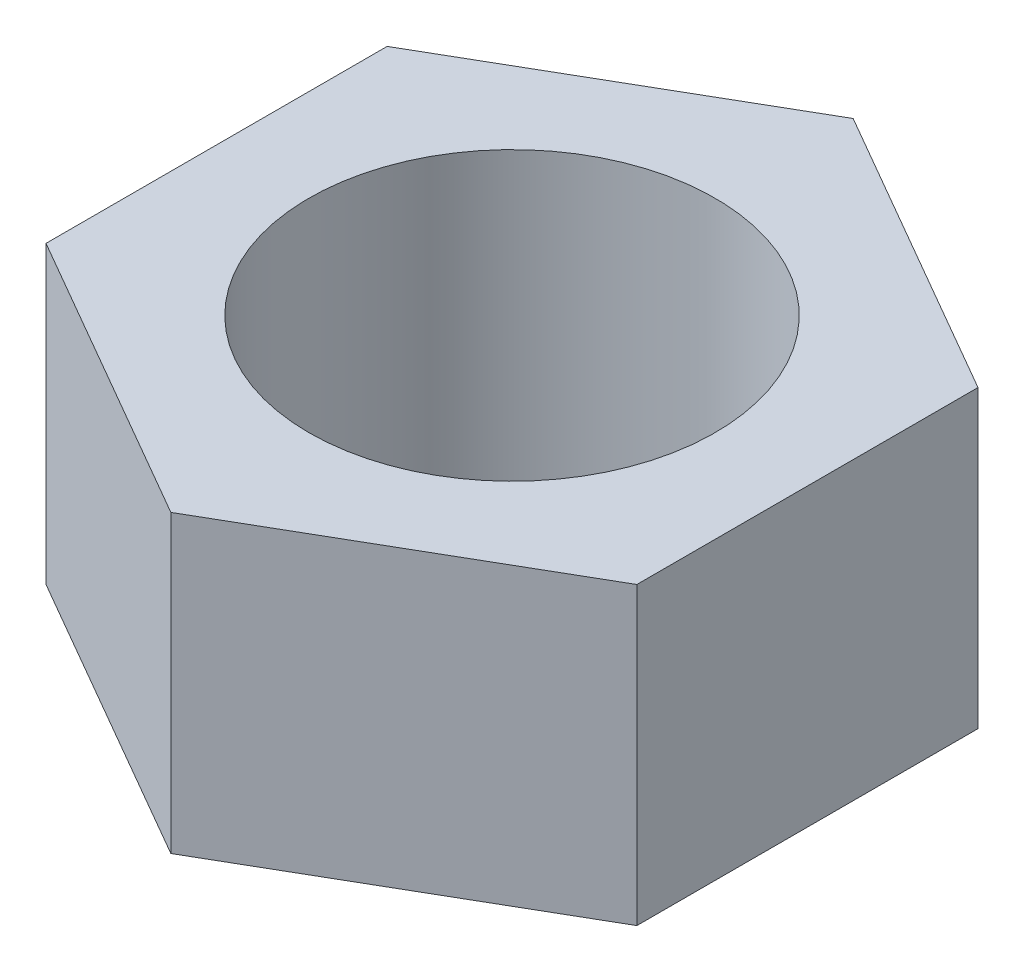
ISO-10303-21;
HEADER;
FILE_DESCRIPTION(('STEP AP214'),'2;1');
FILE_NAME('part.step','',(''),(''),'','','');
FILE_SCHEMA(('AUTOMOTIVE_DESIGN { 1 0 10303 214 1 1 1 1 }'));
ENDSEC;
DATA;
#1=APPLICATION_CONTEXT('core data for automotive mechanical design processes');
#2=APPLICATION_PROTOCOL_DEFINITION('international standard','automotive_design',2000,#1);
#3=PRODUCT_CONTEXT('',#1,'mechanical');
#4=PRODUCT('Part','Part','',(#3));
#5=PRODUCT_RELATED_PRODUCT_CATEGORY('part','',(#4));
#6=PRODUCT_DEFINITION_FORMATION('','',#4);
#7=PRODUCT_DEFINITION_CONTEXT('part definition',#1,'design');
#8=PRODUCT_DEFINITION('design','',#6,#7);
#9=PRODUCT_DEFINITION_SHAPE('','',#8);
#10=(LENGTH_UNIT() NAMED_UNIT(*) SI_UNIT(.MILLI.,.METRE.));
#11=(NAMED_UNIT(*) PLANE_ANGLE_UNIT() SI_UNIT($,.RADIAN.));
#12=(NAMED_UNIT(*) SI_UNIT($,.STERADIAN.) SOLID_ANGLE_UNIT());
#13=UNCERTAINTY_MEASURE_WITH_UNIT(LENGTH_MEASURE(1.E-05),#10,'distance_accuracy_value','');
#14=(GEOMETRIC_REPRESENTATION_CONTEXT(3) GLOBAL_UNCERTAINTY_ASSIGNED_CONTEXT((#13)) GLOBAL_UNIT_ASSIGNED_CONTEXT((#10,
#11,#12)) REPRESENTATION_CONTEXT('',''));
#15=CARTESIAN_POINT('',(0.,0.,0.));
#16=DIRECTION('',(0.,0.,1.));
#17=DIRECTION('',(1.,0.,0.));
#18=AXIS2_PLACEMENT_3D('',#15,#16,#17);
#19=CARTESIAN_POINT('',(3.99999999999997,4.,-2.30940107675855));
#20=DIRECTION('',(-0.499999999999995,0.,0.866025403784441));
#21=DIRECTION('',(0.866025403784442,0.,0.499999999999995));
#22=AXIS2_PLACEMENT_3D('',#19,#20,#21);
#23=PLANE('',#22);
#24=DIRECTION('',(-0.866025403784441,0.,-0.499999999999995));
#25=VECTOR('',#24,1.);
#26=CARTESIAN_POINT('',(3.99999999999997,0.,-2.30940107675855));
#27=LINE('',#26,#25);
#28=CARTESIAN_POINT('',(3.99999999999997,0.,-2.30940107675855));
#29=VERTEX_POINT('',#28);
#30=CARTESIAN_POINT('',(0.,0.,-4.618802153517));
#31=VERTEX_POINT('',#30);
#32=EDGE_CURVE('E117',#29,#31,#27,.T.);
#33=ORIENTED_EDGE('',*,*,#32,.T.);
#34=DIRECTION('',(0.,-1.,0.));
#35=VECTOR('',#34,1.);
#36=CARTESIAN_POINT('',(0.,4.,-4.618802153517));
#37=LINE('',#36,#35);
#38=CARTESIAN_POINT('',(0.,4.,-4.618802153517));
#39=VERTEX_POINT('',#38);
#40=EDGE_CURVE('E11',#39,#31,#37,.T.);
#41=ORIENTED_EDGE('',*,*,#40,.F.);
#42=DIRECTION('',(-0.866025403784441,0.,-0.499999999999995));
#43=VECTOR('',#42,1.);
#44=CARTESIAN_POINT('',(3.99999999999997,4.,-2.30940107675855));
#45=LINE('',#44,#43);
#46=CARTESIAN_POINT('',(3.99999999999997,4.,-2.30940107675855));
#47=VERTEX_POINT('',#46);
#48=EDGE_CURVE('E128',#47,#39,#45,.T.);
#49=ORIENTED_EDGE('',*,*,#48,.F.);
#50=DIRECTION('',(0.,-1.,0.));
#51=VECTOR('',#50,1.);
#52=CARTESIAN_POINT('',(3.99999999999997,4.,-2.30940107675855));
#53=LINE('',#52,#51);
#54=EDGE_CURVE('E113',#47,#29,#53,.T.);
#55=ORIENTED_EDGE('',*,*,#54,.T.);
#56=EDGE_LOOP('',(#33,#41,#49,#55));
#57=FACE_BOUND('',#56,.T.);
#58=ADVANCED_FACE('F33',(#57),#23,.F.);
#59=CARTESIAN_POINT('',(0.,4.,-4.618802153517));
#60=DIRECTION('',(0.500000000000001,0.,0.866025403784438));
#61=DIRECTION('',(0.866025403784438,0.,-0.500000000000001));
#62=AXIS2_PLACEMENT_3D('',#59,#60,#61);
#63=PLANE('',#62);
#64=DIRECTION('',(-0.866025403784438,0.,0.500000000000001));
#65=VECTOR('',#64,1.);
#66=CARTESIAN_POINT('',(0.,0.,-4.618802153517));
#67=LINE('',#66,#65);
#68=CARTESIAN_POINT('',(-4.,0.,-2.30940107675849));
#69=VERTEX_POINT('',#68);
#70=EDGE_CURVE('E120',#31,#69,#67,.T.);
#71=ORIENTED_EDGE('',*,*,#70,.T.);
#72=DIRECTION('',(0.,-1.,0.));
#73=VECTOR('',#72,1.);
#74=CARTESIAN_POINT('',(-4.,4.,-2.30940107675849));
#75=LINE('',#74,#73);
#76=CARTESIAN_POINT('',(-4.,4.,-2.30940107675849));
#77=VERTEX_POINT('',#76);
#78=EDGE_CURVE('E41',#77,#69,#75,.T.);
#79=ORIENTED_EDGE('',*,*,#78,.F.);
#80=DIRECTION('',(-0.866025403784438,0.,0.500000000000001));
#81=VECTOR('',#80,1.);
#82=CARTESIAN_POINT('',(0.,4.,-4.618802153517));
#83=LINE('',#82,#81);
#84=EDGE_CURVE('E86',#39,#77,#83,.T.);
#85=ORIENTED_EDGE('',*,*,#84,.F.);
#86=ORIENTED_EDGE('',*,*,#40,.T.);
#87=EDGE_LOOP('',(#71,#79,#85,#86));
#88=FACE_BOUND('',#87,.T.);
#89=ADVANCED_FACE('F153',(#88),#63,.F.);
#90=CARTESIAN_POINT('',(-4.,4.,-2.30940107675849));
#91=DIRECTION('',(1.,0.,0.));
#92=DIRECTION('',(0.,0.,-1.));
#93=AXIS2_PLACEMENT_3D('',#90,#91,#92);
#94=PLANE('',#93);
#95=DIRECTION('',(0.,0.,1.));
#96=VECTOR('',#95,1.);
#97=CARTESIAN_POINT('',(-4.,0.,-2.30940107675849));
#98=LINE('',#97,#96);
#99=CARTESIAN_POINT('',(-3.99999999999998,0.,2.30940107675852));
#100=VERTEX_POINT('',#99);
#101=EDGE_CURVE('E123',#69,#100,#98,.T.);
#102=ORIENTED_EDGE('',*,*,#101,.T.);
#103=DIRECTION('',(0.,-1.,0.));
#104=VECTOR('',#103,1.);
#105=CARTESIAN_POINT('',(-3.99999999999998,4.,2.30940107675852));
#106=LINE('',#105,#104);
#107=CARTESIAN_POINT('',(-3.99999999999998,4.,2.30940107675852));
#108=VERTEX_POINT('',#107);
#109=EDGE_CURVE('E108',#108,#100,#106,.T.);
#110=ORIENTED_EDGE('',*,*,#109,.F.);
#111=DIRECTION('',(0.,0.,1.));
#112=VECTOR('',#111,1.);
#113=CARTESIAN_POINT('',(-4.,4.,-2.30940107675849));
#114=LINE('',#113,#112);
#115=EDGE_CURVE('E99',#77,#108,#114,.T.);
#116=ORIENTED_EDGE('',*,*,#115,.F.);
#117=ORIENTED_EDGE('',*,*,#78,.T.);
#118=EDGE_LOOP('',(#102,#110,#116,#117));
#119=FACE_BOUND('',#118,.T.);
#120=ADVANCED_FACE('F134',(#119),#94,.F.);
#121=CARTESIAN_POINT('',(-3.99999999999998,4.,2.30940107675852));
#122=DIRECTION('',(0.499999999999995,0.,-0.866025403784441));
#123=DIRECTION('',(-0.866025403784442,0.,-0.499999999999995));
#124=AXIS2_PLACEMENT_3D('',#121,#122,#123);
#125=PLANE('',#124);
#126=DIRECTION('',(0.866025403784441,0.,0.499999999999995));
#127=VECTOR('',#126,1.);
#128=CARTESIAN_POINT('',(-3.99999999999998,0.,2.30940107675852));
#129=LINE('',#128,#127);
#130=CARTESIAN_POINT('',(0.,0.,4.618802153517));
#131=VERTEX_POINT('',#130);
#132=EDGE_CURVE('E107',#100,#131,#129,.T.);
#133=ORIENTED_EDGE('',*,*,#132,.T.);
#134=DIRECTION('',(0.,-1.,0.));
#135=VECTOR('',#134,1.);
#136=CARTESIAN_POINT('',(0.,4.,4.618802153517));
#137=LINE('',#136,#135);
#138=CARTESIAN_POINT('',(0.,4.,4.618802153517));
#139=VERTEX_POINT('',#138);
#140=EDGE_CURVE('E104',#139,#131,#137,.T.);
#141=ORIENTED_EDGE('',*,*,#140,.F.);
#142=DIRECTION('',(0.866025403784441,0.,0.499999999999995));
#143=VECTOR('',#142,1.);
#144=CARTESIAN_POINT('',(-3.99999999999998,4.,2.30940107675852));
#145=LINE('',#144,#143);
#146=EDGE_CURVE('E93',#108,#139,#145,.T.);
#147=ORIENTED_EDGE('',*,*,#146,.F.);
#148=ORIENTED_EDGE('',*,*,#109,.T.);
#149=EDGE_LOOP('',(#133,#141,#147,#148));
#150=FACE_BOUND('',#149,.T.);
#151=ADVANCED_FACE('F105',(#150),#125,.F.);
#152=CARTESIAN_POINT('',(0.,4.,4.618802153517));
#153=DIRECTION('',(-0.500000000000007,0.,-0.866025403784435));
#154=DIRECTION('',(-0.866025403784434,0.,0.500000000000007));
#155=AXIS2_PLACEMENT_3D('',#152,#153,#154);
#156=PLANE('',#155);
#157=DIRECTION('',(0.866025403784434,0.,-0.500000000000007));
#158=VECTOR('',#157,1.);
#159=CARTESIAN_POINT('',(0.,0.,4.618802153517));
#160=LINE('',#159,#158);
#161=CARTESIAN_POINT('',(4.00000000000002,0.,2.30940107675846));
#162=VERTEX_POINT('',#161);
#163=EDGE_CURVE('E72',#131,#162,#160,.T.);
#164=ORIENTED_EDGE('',*,*,#163,.T.);
#165=DIRECTION('',(0.,-1.,0.));
#166=VECTOR('',#165,1.);
#167=CARTESIAN_POINT('',(4.00000000000002,4.,2.30940107675846));
#168=LINE('',#167,#166);
#169=CARTESIAN_POINT('',(4.00000000000002,4.,2.30940107675846));
#170=VERTEX_POINT('',#169);
#171=EDGE_CURVE('E109',#170,#162,#168,.T.);
#172=ORIENTED_EDGE('',*,*,#171,.F.);
#173=DIRECTION('',(0.866025403784434,0.,-0.500000000000007));
#174=VECTOR('',#173,1.);
#175=CARTESIAN_POINT('',(0.,4.,4.618802153517));
#176=LINE('',#175,#174);
#177=EDGE_CURVE('E97',#139,#170,#176,.T.);
#178=ORIENTED_EDGE('',*,*,#177,.F.);
#179=ORIENTED_EDGE('',*,*,#140,.T.);
#180=EDGE_LOOP('',(#164,#172,#178,#179));
#181=FACE_BOUND('',#180,.T.);
#182=ADVANCED_FACE('F111',(#181),#156,.F.);
#183=CARTESIAN_POINT('',(4.00000000000002,4.,2.30940107675846));
#184=DIRECTION('',(-1.,0.,0.));
#185=DIRECTION('',(0.,0.,1.));
#186=AXIS2_PLACEMENT_3D('',#183,#184,#185);
#187=PLANE('',#186);
#188=DIRECTION('',(0.,0.,-1.));
#189=VECTOR('',#188,1.);
#190=CARTESIAN_POINT('',(4.00000000000002,0.,2.30940107675846));
#191=LINE('',#190,#189);
#192=EDGE_CURVE('E78',#162,#29,#191,.T.);
#193=ORIENTED_EDGE('',*,*,#192,.T.);
#194=ORIENTED_EDGE('',*,*,#54,.F.);
#195=DIRECTION('',(0.,0.,-1.));
#196=VECTOR('',#195,1.);
#197=CARTESIAN_POINT('',(4.00000000000002,4.,2.30940107675846));
#198=LINE('',#197,#196);
#199=EDGE_CURVE('E49',#170,#47,#198,.T.);
#200=ORIENTED_EDGE('',*,*,#199,.F.);
#201=ORIENTED_EDGE('',*,*,#171,.T.);
#202=EDGE_LOOP('',(#193,#194,#200,#201));
#203=FACE_BOUND('',#202,.T.);
#204=ADVANCED_FACE('F141',(#203),#187,.F.);
#205=CARTESIAN_POINT('',(0.,4.,0.));
#206=DIRECTION('',(0.,1.,0.));
#207=DIRECTION('',(0.,0.,1.));
#208=AXIS2_PLACEMENT_3D('',#205,#206,#207);
#209=PLANE('',#208);
#210=CARTESIAN_POINT('',(0.,4.,0.));
#211=DIRECTION('',(0.,1.,0.));
#212=DIRECTION('',(0.,0.,1.));
#213=AXIS2_PLACEMENT_3D('',#210,#211,#212);
#214=CIRCLE('',#213,2.75);
#215=CARTESIAN_POINT('',(0.,4.,2.75));
#216=VERTEX_POINT('',#215);
#217=EDGE_CURVE('E208',#216,#216,#214,.T.);
#218=ORIENTED_EDGE('',*,*,#217,.F.);
#219=EDGE_LOOP('',(#218));
#220=FACE_BOUND('',#219,.T.);
#221=ORIENTED_EDGE('',*,*,#48,.T.);
#222=ORIENTED_EDGE('',*,*,#84,.T.);
#223=ORIENTED_EDGE('',*,*,#115,.T.);
#224=ORIENTED_EDGE('',*,*,#146,.T.);
#225=ORIENTED_EDGE('',*,*,#177,.T.);
#226=ORIENTED_EDGE('',*,*,#199,.T.);
#227=EDGE_LOOP('',(#221,#222,#223,#224,#225,#226));
#228=FACE_BOUND('',#227,.T.);
#229=ADVANCED_FACE('F95',(#220,#228),#209,.T.);
#230=CARTESIAN_POINT('',(0.,0.,0.));
#231=DIRECTION('',(0.,1.,0.));
#232=DIRECTION('',(0.,0.,1.));
#233=AXIS2_PLACEMENT_3D('',#230,#231,#232);
#234=PLANE('',#233);
#235=CARTESIAN_POINT('',(0.,0.,0.));
#236=DIRECTION('',(0.,1.,0.));
#237=DIRECTION('',(0.,0.,1.));
#238=AXIS2_PLACEMENT_3D('',#235,#236,#237);
#239=CIRCLE('',#238,2.75);
#240=CARTESIAN_POINT('',(0.,0.,2.75));
#241=VERTEX_POINT('',#240);
#242=EDGE_CURVE('E121',#241,#241,#239,.T.);
#243=ORIENTED_EDGE('',*,*,#242,.T.);
#244=EDGE_LOOP('',(#243));
#245=FACE_BOUND('',#244,.T.);
#246=ORIENTED_EDGE('',*,*,#32,.F.);
#247=ORIENTED_EDGE('',*,*,#192,.F.);
#248=ORIENTED_EDGE('',*,*,#163,.F.);
#249=ORIENTED_EDGE('',*,*,#132,.F.);
#250=ORIENTED_EDGE('',*,*,#101,.F.);
#251=ORIENTED_EDGE('',*,*,#70,.F.);
#252=EDGE_LOOP('',(#246,#247,#248,#249,#250,#251));
#253=FACE_BOUND('',#252,.T.);
#254=ADVANCED_FACE('F137',(#245,#253),#234,.F.);
#255=CARTESIAN_POINT('',(0.,4.,0.));
#256=DIRECTION('',(0.,1.,0.));
#257=DIRECTION('',(0.,0.,1.));
#258=AXIS2_PLACEMENT_3D('',#255,#256,#257);
#259=CYLINDRICAL_SURFACE('',#258,2.75);
#260=ORIENTED_EDGE('',*,*,#242,.F.);
#261=EDGE_LOOP('',(#260));
#262=FACE_BOUND('',#261,.T.);
#263=ORIENTED_EDGE('',*,*,#217,.T.);
#264=EDGE_LOOP('',(#263));
#265=FACE_BOUND('',#264,.T.);
#266=ADVANCED_FACE('F190',(#262,#265),#259,.F.);
#267=CLOSED_SHELL('',(#58,#89,#120,#151,#182,#204,#229,#254,#266));
#268=MANIFOLD_SOLID_BREP('B2',#267);
#269=ADVANCED_BREP_SHAPE_REPRESENTATION('',(#18,#268),#14);
#270=SHAPE_DEFINITION_REPRESENTATION(#9,#269);
ENDSEC;
END-ISO-10303-21;
